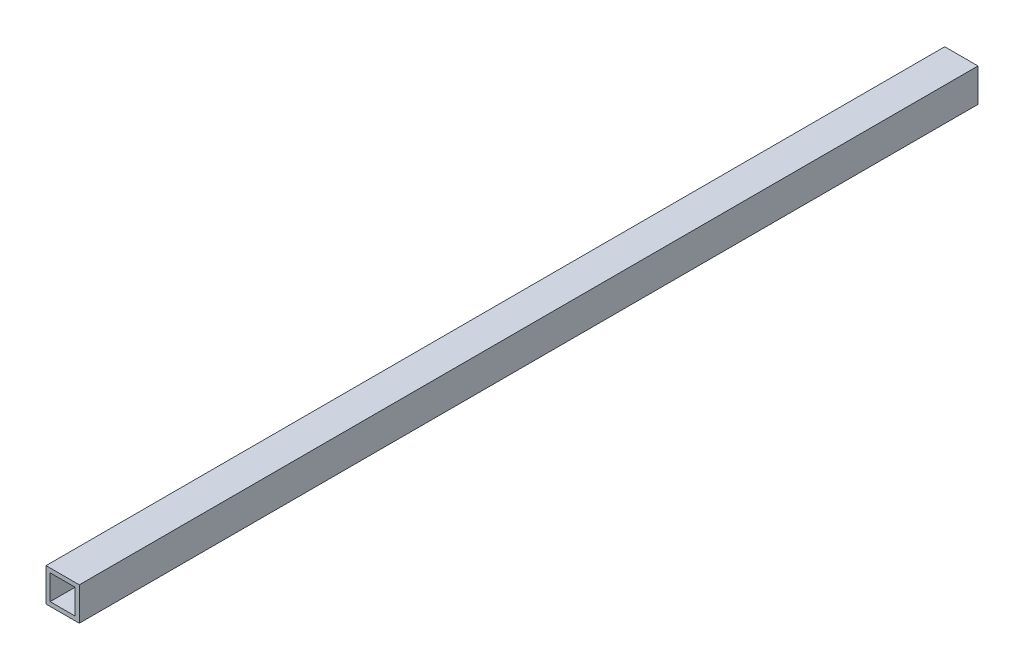
ISO-10303-21;
HEADER;
FILE_DESCRIPTION(('STEP AP214'),'2;1');
FILE_NAME('part.step','',(''),(''),'','','');
FILE_SCHEMA(('AUTOMOTIVE_DESIGN { 1 0 10303 214 1 1 1 1 }'));
ENDSEC;
DATA;
#1=APPLICATION_CONTEXT('core data for automotive mechanical design processes');
#2=APPLICATION_PROTOCOL_DEFINITION('international standard','automotive_design',2000,#1);
#3=PRODUCT_CONTEXT('',#1,'mechanical');
#4=PRODUCT('Part','Part','',(#3));
#5=PRODUCT_RELATED_PRODUCT_CATEGORY('part','',(#4));
#6=PRODUCT_DEFINITION_FORMATION('','',#4);
#7=PRODUCT_DEFINITION_CONTEXT('part definition',#1,'design');
#8=PRODUCT_DEFINITION('design','',#6,#7);
#9=PRODUCT_DEFINITION_SHAPE('','',#8);
#10=(LENGTH_UNIT() NAMED_UNIT(*) SI_UNIT(.MILLI.,.METRE.));
#11=(NAMED_UNIT(*) PLANE_ANGLE_UNIT() SI_UNIT($,.RADIAN.));
#12=(NAMED_UNIT(*) SI_UNIT($,.STERADIAN.) SOLID_ANGLE_UNIT());
#13=UNCERTAINTY_MEASURE_WITH_UNIT(LENGTH_MEASURE(1.E-05),#10,'distance_accuracy_value','');
#14=(GEOMETRIC_REPRESENTATION_CONTEXT(3) GLOBAL_UNCERTAINTY_ASSIGNED_CONTEXT((#13)) GLOBAL_UNIT_ASSIGNED_CONTEXT((#10,
#11,#12)) REPRESENTATION_CONTEXT('',''));
#15=CARTESIAN_POINT('',(0.,0.,0.));
#16=DIRECTION('',(0.,0.,1.));
#17=DIRECTION('',(1.,0.,0.));
#18=AXIS2_PLACEMENT_3D('',#15,#16,#17);
#19=CARTESIAN_POINT('',(0.,0.,685.8));
#20=DIRECTION('',(0.,0.,1.));
#21=DIRECTION('',(1.,0.,0.));
#22=AXIS2_PLACEMENT_3D('',#19,#20,#21);
#23=PLANE('',#22);
#24=DIRECTION('',(0.,-1.,0.));
#25=VECTOR('',#24,1.);
#26=CARTESIAN_POINT('',(-9.64921142042019,14.6982173962215,685.8));
#27=LINE('',#26,#25);
#28=CARTESIAN_POINT('',(-9.64921142042019,14.6982173962215,685.8));
#29=VERTEX_POINT('',#28);
#30=CARTESIAN_POINT('',(-9.64921142042019,-10.7017826037785,685.8));
#31=VERTEX_POINT('',#30);
#32=EDGE_CURVE('E134',#29,#31,#27,.T.);
#33=ORIENTED_EDGE('',*,*,#32,.T.);
#34=DIRECTION('',(1.,0.,0.));
#35=VECTOR('',#34,1.);
#36=CARTESIAN_POINT('',(-9.64921142042019,-10.7017826037785,685.8));
#37=LINE('',#36,#35);
#38=CARTESIAN_POINT('',(15.7507885795798,-10.7017826037785,685.8));
#39=VERTEX_POINT('',#38);
#40=EDGE_CURVE('E137',#31,#39,#37,.T.);
#41=ORIENTED_EDGE('',*,*,#40,.T.);
#42=DIRECTION('',(0.,1.,0.));
#43=VECTOR('',#42,1.);
#44=CARTESIAN_POINT('',(15.7507885795798,14.6982173962215,685.8));
#45=LINE('',#44,#43);
#46=CARTESIAN_POINT('',(15.7507885795798,14.6982173962215,685.8));
#47=VERTEX_POINT('',#46);
#48=EDGE_CURVE('E140',#39,#47,#45,.T.);
#49=ORIENTED_EDGE('',*,*,#48,.T.);
#50=DIRECTION('',(-1.,0.,0.));
#51=VECTOR('',#50,1.);
#52=CARTESIAN_POINT('',(-9.64921142042019,14.6982173962215,685.8));
#53=LINE('',#52,#51);
#54=EDGE_CURVE('E142',#47,#29,#53,.T.);
#55=ORIENTED_EDGE('',*,*,#54,.T.);
#56=EDGE_LOOP('',(#33,#41,#49,#55));
#57=FACE_BOUND('',#56,.T.);
#58=DIRECTION('',(1.,0.,0.));
#59=VECTOR('',#58,1.);
#60=CARTESIAN_POINT('',(-6.47421142042019,-7.52678260377854,685.8));
#61=LINE('',#60,#59);
#62=CARTESIAN_POINT('',(-6.47421142042019,-7.52678260377854,685.8));
#63=VERTEX_POINT('',#62);
#64=CARTESIAN_POINT('',(12.5757885795798,-7.52678260377854,685.8));
#65=VERTEX_POINT('',#64);
#66=EDGE_CURVE('E106',#63,#65,#61,.T.);
#67=ORIENTED_EDGE('',*,*,#66,.F.);
#68=DIRECTION('',(0.,-1.,0.));
#69=VECTOR('',#68,1.);
#70=CARTESIAN_POINT('',(-6.47421142042019,11.5232173962215,685.8));
#71=LINE('',#70,#69);
#72=CARTESIAN_POINT('',(-6.47421142042019,11.5232173962215,685.8));
#73=VERTEX_POINT('',#72);
#74=EDGE_CURVE('E98',#73,#63,#71,.T.);
#75=ORIENTED_EDGE('',*,*,#74,.F.);
#76=DIRECTION('',(-1.,0.,0.));
#77=VECTOR('',#76,1.);
#78=CARTESIAN_POINT('',(-6.47421142042019,11.5232173962215,685.8));
#79=LINE('',#78,#77);
#80=CARTESIAN_POINT('',(12.5757885795798,11.5232173962215,685.8));
#81=VERTEX_POINT('',#80);
#82=EDGE_CURVE('E120',#81,#73,#79,.T.);
#83=ORIENTED_EDGE('',*,*,#82,.F.);
#84=DIRECTION('',(0.,1.,0.));
#85=VECTOR('',#84,1.);
#86=CARTESIAN_POINT('',(12.5757885795798,11.5232173962215,685.8));
#87=LINE('',#86,#85);
#88=EDGE_CURVE('E118',#65,#81,#87,.T.);
#89=ORIENTED_EDGE('',*,*,#88,.F.);
#90=EDGE_LOOP('',(#67,#75,#83,#89));
#91=FACE_BOUND('',#90,.T.);
#92=ADVANCED_FACE('F33',(#57,#91),#23,.T.);
#93=CARTESIAN_POINT('',(0.,0.,0.));
#94=DIRECTION('',(0.,0.,1.));
#95=DIRECTION('',(1.,0.,0.));
#96=AXIS2_PLACEMENT_3D('',#93,#94,#95);
#97=PLANE('',#96);
#98=DIRECTION('',(0.,-1.,0.));
#99=VECTOR('',#98,1.);
#100=CARTESIAN_POINT('',(-9.64921142042019,14.6982173962215,0.));
#101=LINE('',#100,#99);
#102=CARTESIAN_POINT('',(-9.64921142042019,14.6982173962215,0.));
#103=VERTEX_POINT('',#102);
#104=CARTESIAN_POINT('',(-9.64921142042019,-10.7017826037785,0.));
#105=VERTEX_POINT('',#104);
#106=EDGE_CURVE('E114',#103,#105,#101,.T.);
#107=ORIENTED_EDGE('',*,*,#106,.F.);
#108=DIRECTION('',(-1.,0.,0.));
#109=VECTOR('',#108,1.);
#110=CARTESIAN_POINT('',(-9.64921142042019,14.6982173962215,0.));
#111=LINE('',#110,#109);
#112=CARTESIAN_POINT('',(15.7507885795798,14.6982173962215,0.));
#113=VERTEX_POINT('',#112);
#114=EDGE_CURVE('E138',#113,#103,#111,.T.);
#115=ORIENTED_EDGE('',*,*,#114,.F.);
#116=DIRECTION('',(0.,1.,0.));
#117=VECTOR('',#116,1.);
#118=CARTESIAN_POINT('',(15.7507885795798,14.6982173962215,0.));
#119=LINE('',#118,#117);
#120=CARTESIAN_POINT('',(15.7507885795798,-10.7017826037785,0.));
#121=VERTEX_POINT('',#120);
#122=EDGE_CURVE('E149',#121,#113,#119,.T.);
#123=ORIENTED_EDGE('',*,*,#122,.F.);
#124=DIRECTION('',(1.,0.,0.));
#125=VECTOR('',#124,1.);
#126=CARTESIAN_POINT('',(-9.64921142042019,-10.7017826037785,0.));
#127=LINE('',#126,#125);
#128=EDGE_CURVE('E147',#105,#121,#127,.T.);
#129=ORIENTED_EDGE('',*,*,#128,.F.);
#130=EDGE_LOOP('',(#107,#115,#123,#129));
#131=FACE_BOUND('',#130,.T.);
#132=DIRECTION('',(0.,-1.,0.));
#133=VECTOR('',#132,1.);
#134=CARTESIAN_POINT('',(-6.47421142042019,11.5232173962215,0.));
#135=LINE('',#134,#133);
#136=CARTESIAN_POINT('',(-6.47421142042019,11.5232173962215,0.));
#137=VERTEX_POINT('',#136);
#138=CARTESIAN_POINT('',(-6.47421142042019,-7.52678260377854,0.));
#139=VERTEX_POINT('',#138);
#140=EDGE_CURVE('E56',#137,#139,#135,.T.);
#141=ORIENTED_EDGE('',*,*,#140,.T.);
#142=DIRECTION('',(1.,0.,0.));
#143=VECTOR('',#142,1.);
#144=CARTESIAN_POINT('',(-6.47421142042019,-7.52678260377854,0.));
#145=LINE('',#144,#143);
#146=CARTESIAN_POINT('',(12.5757885795798,-7.52678260377854,0.));
#147=VERTEX_POINT('',#146);
#148=EDGE_CURVE('E113',#139,#147,#145,.T.);
#149=ORIENTED_EDGE('',*,*,#148,.T.);
#150=DIRECTION('',(0.,1.,0.));
#151=VECTOR('',#150,1.);
#152=CARTESIAN_POINT('',(12.5757885795798,11.5232173962215,0.));
#153=LINE('',#152,#151);
#154=CARTESIAN_POINT('',(12.5757885795798,11.5232173962215,0.));
#155=VERTEX_POINT('',#154);
#156=EDGE_CURVE('E126',#147,#155,#153,.T.);
#157=ORIENTED_EDGE('',*,*,#156,.T.);
#158=DIRECTION('',(-1.,0.,0.));
#159=VECTOR('',#158,1.);
#160=CARTESIAN_POINT('',(-6.47421142042019,11.5232173962215,0.));
#161=LINE('',#160,#159);
#162=EDGE_CURVE('E107',#155,#137,#161,.T.);
#163=ORIENTED_EDGE('',*,*,#162,.T.);
#164=EDGE_LOOP('',(#141,#149,#157,#163));
#165=FACE_BOUND('',#164,.T.);
#166=ADVANCED_FACE('F167',(#131,#165),#97,.F.);
#167=CARTESIAN_POINT('',(-9.64921142042019,14.6982173962215,685.8));
#168=DIRECTION('',(1.,0.,0.));
#169=DIRECTION('',(0.,0.,-1.));
#170=AXIS2_PLACEMENT_3D('',#167,#168,#169);
#171=PLANE('',#170);
#172=ORIENTED_EDGE('',*,*,#106,.T.);
#173=DIRECTION('',(0.,0.,-1.));
#174=VECTOR('',#173,1.);
#175=CARTESIAN_POINT('',(-9.64921142042019,-10.7017826037785,685.8));
#176=LINE('',#175,#174);
#177=EDGE_CURVE('E11',#31,#105,#176,.T.);
#178=ORIENTED_EDGE('',*,*,#177,.F.);
#179=ORIENTED_EDGE('',*,*,#32,.F.);
#180=DIRECTION('',(0.,0.,-1.));
#181=VECTOR('',#180,1.);
#182=CARTESIAN_POINT('',(-9.64921142042019,14.6982173962215,685.8));
#183=LINE('',#182,#181);
#184=EDGE_CURVE('E144',#29,#103,#183,.T.);
#185=ORIENTED_EDGE('',*,*,#184,.T.);
#186=EDGE_LOOP('',(#172,#178,#179,#185));
#187=FACE_BOUND('',#186,.T.);
#188=ADVANCED_FACE('F35',(#187),#171,.F.);
#189=CARTESIAN_POINT('',(-9.64921142042019,-10.7017826037785,685.8));
#190=DIRECTION('',(0.,1.,0.));
#191=DIRECTION('',(0.,0.,1.));
#192=AXIS2_PLACEMENT_3D('',#189,#190,#191);
#193=PLANE('',#192);
#194=ORIENTED_EDGE('',*,*,#128,.T.);
#195=DIRECTION('',(0.,0.,-1.));
#196=VECTOR('',#195,1.);
#197=CARTESIAN_POINT('',(15.7507885795798,-10.7017826037785,685.8));
#198=LINE('',#197,#196);
#199=EDGE_CURVE('E41',#39,#121,#198,.T.);
#200=ORIENTED_EDGE('',*,*,#199,.F.);
#201=ORIENTED_EDGE('',*,*,#40,.F.);
#202=ORIENTED_EDGE('',*,*,#177,.T.);
#203=EDGE_LOOP('',(#194,#200,#201,#202));
#204=FACE_BOUND('',#203,.T.);
#205=ADVANCED_FACE('F177',(#204),#193,.F.);
#206=CARTESIAN_POINT('',(15.7507885795798,14.6982173962215,685.8));
#207=DIRECTION('',(-1.,0.,0.));
#208=DIRECTION('',(0.,-1.,0.));
#209=AXIS2_PLACEMENT_3D('',#206,#207,#208);
#210=PLANE('',#209);
#211=ORIENTED_EDGE('',*,*,#122,.T.);
#212=DIRECTION('',(0.,0.,-1.));
#213=VECTOR('',#212,1.);
#214=CARTESIAN_POINT('',(15.7507885795798,14.6982173962215,685.8));
#215=LINE('',#214,#213);
#216=EDGE_CURVE('E154',#47,#113,#215,.T.);
#217=ORIENTED_EDGE('',*,*,#216,.F.);
#218=ORIENTED_EDGE('',*,*,#48,.F.);
#219=ORIENTED_EDGE('',*,*,#199,.T.);
#220=EDGE_LOOP('',(#211,#217,#218,#219));
#221=FACE_BOUND('',#220,.T.);
#222=ADVANCED_FACE('F161',(#221),#210,.F.);
#223=CARTESIAN_POINT('',(-9.64921142042019,14.6982173962215,685.8));
#224=DIRECTION('',(0.,-1.,0.));
#225=DIRECTION('',(0.,0.,-1.));
#226=AXIS2_PLACEMENT_3D('',#223,#224,#225);
#227=PLANE('',#226);
#228=ORIENTED_EDGE('',*,*,#114,.T.);
#229=ORIENTED_EDGE('',*,*,#184,.F.);
#230=ORIENTED_EDGE('',*,*,#54,.F.);
#231=ORIENTED_EDGE('',*,*,#216,.T.);
#232=EDGE_LOOP('',(#228,#229,#230,#231));
#233=FACE_BOUND('',#232,.T.);
#234=ADVANCED_FACE('F171',(#233),#227,.F.);
#235=CARTESIAN_POINT('',(-6.47421142042019,11.5232173962215,685.8));
#236=DIRECTION('',(1.,0.,0.));
#237=DIRECTION('',(0.,1.,0.));
#238=AXIS2_PLACEMENT_3D('',#235,#236,#237);
#239=PLANE('',#238);
#240=ORIENTED_EDGE('',*,*,#140,.F.);
#241=DIRECTION('',(0.,0.,-1.));
#242=VECTOR('',#241,1.);
#243=CARTESIAN_POINT('',(-6.47421142042019,11.5232173962215,685.8));
#244=LINE('',#243,#242);
#245=EDGE_CURVE('E102',#73,#137,#244,.T.);
#246=ORIENTED_EDGE('',*,*,#245,.F.);
#247=ORIENTED_EDGE('',*,*,#74,.T.);
#248=DIRECTION('',(0.,0.,-1.));
#249=VECTOR('',#248,1.);
#250=CARTESIAN_POINT('',(-6.47421142042019,-7.52678260377854,685.8));
#251=LINE('',#250,#249);
#252=EDGE_CURVE('E101',#63,#139,#251,.T.);
#253=ORIENTED_EDGE('',*,*,#252,.T.);
#254=EDGE_LOOP('',(#240,#246,#247,#253));
#255=FACE_BOUND('',#254,.T.);
#256=ADVANCED_FACE('F100',(#255),#239,.T.);
#257=CARTESIAN_POINT('',(-6.47421142042019,-7.52678260377854,685.8));
#258=DIRECTION('',(0.,1.,0.));
#259=DIRECTION('',(-1.,0.,0.));
#260=AXIS2_PLACEMENT_3D('',#257,#258,#259);
#261=PLANE('',#260);
#262=ORIENTED_EDGE('',*,*,#148,.F.);
#263=ORIENTED_EDGE('',*,*,#252,.F.);
#264=ORIENTED_EDGE('',*,*,#66,.T.);
#265=DIRECTION('',(0.,0.,-1.));
#266=VECTOR('',#265,1.);
#267=CARTESIAN_POINT('',(12.5757885795798,-7.52678260377854,685.8));
#268=LINE('',#267,#266);
#269=EDGE_CURVE('E115',#65,#147,#268,.T.);
#270=ORIENTED_EDGE('',*,*,#269,.T.);
#271=EDGE_LOOP('',(#262,#263,#264,#270));
#272=FACE_BOUND('',#271,.T.);
#273=ADVANCED_FACE('F110',(#272),#261,.T.);
#274=CARTESIAN_POINT('',(12.5757885795798,11.5232173962215,685.8));
#275=DIRECTION('',(-1.,0.,0.));
#276=DIRECTION('',(0.,-1.,0.));
#277=AXIS2_PLACEMENT_3D('',#274,#275,#276);
#278=PLANE('',#277);
#279=ORIENTED_EDGE('',*,*,#156,.F.);
#280=ORIENTED_EDGE('',*,*,#269,.F.);
#281=ORIENTED_EDGE('',*,*,#88,.T.);
#282=DIRECTION('',(0.,0.,-1.));
#283=VECTOR('',#282,1.);
#284=CARTESIAN_POINT('',(12.5757885795798,11.5232173962215,685.8));
#285=LINE('',#284,#283);
#286=EDGE_CURVE('E48',#81,#155,#285,.T.);
#287=ORIENTED_EDGE('',*,*,#286,.T.);
#288=EDGE_LOOP('',(#279,#280,#281,#287));
#289=FACE_BOUND('',#288,.T.);
#290=ADVANCED_FACE('F200',(#289),#278,.T.);
#291=CARTESIAN_POINT('',(-6.47421142042019,11.5232173962215,685.8));
#292=DIRECTION('',(0.,-1.,0.));
#293=DIRECTION('',(0.,0.,-1.));
#294=AXIS2_PLACEMENT_3D('',#291,#292,#293);
#295=PLANE('',#294);
#296=ORIENTED_EDGE('',*,*,#162,.F.);
#297=ORIENTED_EDGE('',*,*,#286,.F.);
#298=ORIENTED_EDGE('',*,*,#82,.T.);
#299=ORIENTED_EDGE('',*,*,#245,.T.);
#300=EDGE_LOOP('',(#296,#297,#298,#299));
#301=FACE_BOUND('',#300,.T.);
#302=ADVANCED_FACE('F204',(#301),#295,.T.);
#303=CLOSED_SHELL('',(#92,#166,#188,#205,#222,#234,#256,#273,#290,#302));
#304=MANIFOLD_SOLID_BREP('B2',#303);
#305=ADVANCED_BREP_SHAPE_REPRESENTATION('',(#18,#304),#14);
#306=SHAPE_DEFINITION_REPRESENTATION(#9,#305);
ENDSEC;
END-ISO-10303-21;
